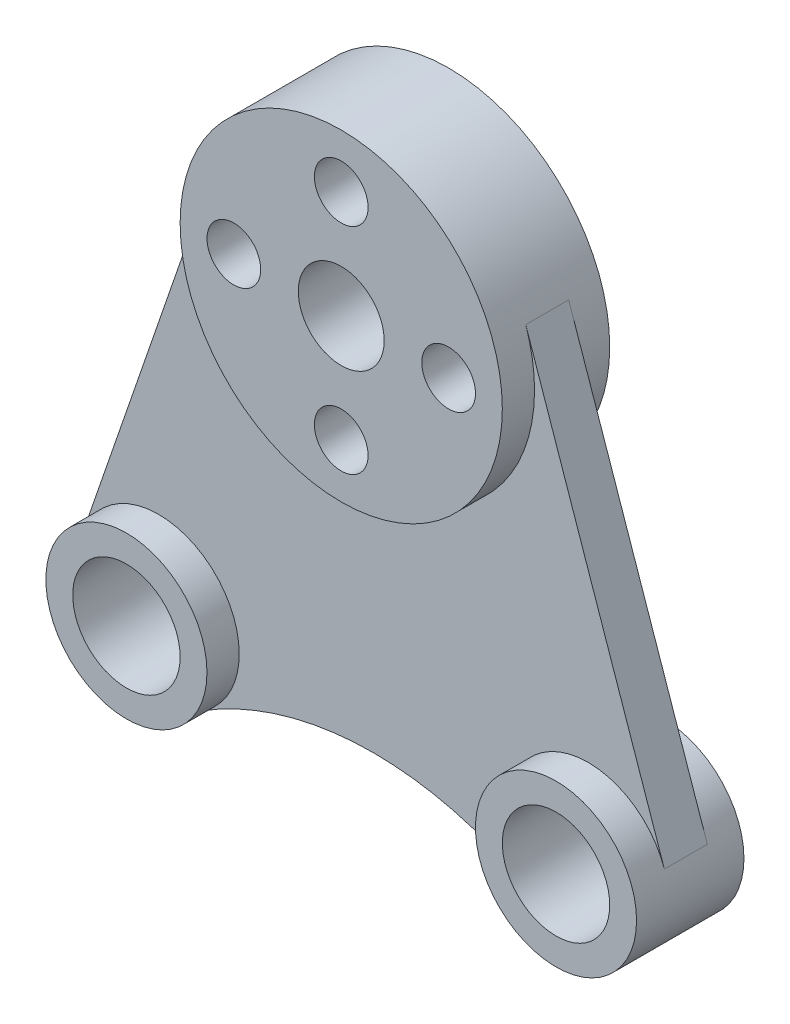
ISO-10303-21;
HEADER;
FILE_DESCRIPTION(('STEP AP214'),'2;1');
FILE_NAME('part.step','',(''),(''),'','','');
FILE_SCHEMA(('AUTOMOTIVE_DESIGN { 1 0 10303 214 1 1 1 1 }'));
ENDSEC;
DATA;
#1=APPLICATION_CONTEXT('core data for automotive mechanical design processes');
#2=APPLICATION_PROTOCOL_DEFINITION('international standard','automotive_design',2000,#1);
#3=PRODUCT_CONTEXT('',#1,'mechanical');
#4=PRODUCT('Part','Part','',(#3));
#5=PRODUCT_RELATED_PRODUCT_CATEGORY('part','',(#4));
#6=PRODUCT_DEFINITION_FORMATION('','',#4);
#7=PRODUCT_DEFINITION_CONTEXT('part definition',#1,'design');
#8=PRODUCT_DEFINITION('design','',#6,#7);
#9=PRODUCT_DEFINITION_SHAPE('','',#8);
#10=(LENGTH_UNIT() NAMED_UNIT(*) SI_UNIT(.MILLI.,.METRE.));
#11=(NAMED_UNIT(*) PLANE_ANGLE_UNIT() SI_UNIT($,.RADIAN.));
#12=(NAMED_UNIT(*) SI_UNIT($,.STERADIAN.) SOLID_ANGLE_UNIT());
#13=UNCERTAINTY_MEASURE_WITH_UNIT(LENGTH_MEASURE(1.E-05),#10,'distance_accuracy_value','');
#14=(GEOMETRIC_REPRESENTATION_CONTEXT(3) GLOBAL_UNCERTAINTY_ASSIGNED_CONTEXT((#13)) GLOBAL_UNIT_ASSIGNED_CONTEXT((#10,
#11,#12)) REPRESENTATION_CONTEXT('',''));
#15=CARTESIAN_POINT('',(0.,0.,0.));
#16=DIRECTION('',(0.,0.,1.));
#17=DIRECTION('',(1.,0.,0.));
#18=AXIS2_PLACEMENT_3D('',#15,#16,#17);
#19=CARTESIAN_POINT('',(0.,0.,10.));
#20=DIRECTION('',(0.,0.,-1.));
#21=DIRECTION('',(-1.,0.,0.));
#22=AXIS2_PLACEMENT_3D('',#19,#20,#21);
#23=CYLINDRICAL_SURFACE('',#22,8.);
#24=CARTESIAN_POINT('',(0.,0.,10.));
#25=DIRECTION('',(0.,0.,1.));
#26=DIRECTION('',(1.,0.,0.));
#27=AXIS2_PLACEMENT_3D('',#24,#25,#26);
#28=CIRCLE('',#27,8.);
#29=CARTESIAN_POINT('',(8.,0.,10.));
#30=VERTEX_POINT('',#29);
#31=EDGE_CURVE('E59',#30,#30,#28,.T.);
#32=ORIENTED_EDGE('',*,*,#31,.T.);
#33=EDGE_LOOP('',(#32));
#34=FACE_BOUND('',#33,.T.);
#35=CARTESIAN_POINT('',(0.,0.,-10.));
#36=DIRECTION('',(0.,0.,1.));
#37=DIRECTION('',(1.,0.,0.));
#38=AXIS2_PLACEMENT_3D('',#35,#36,#37);
#39=CIRCLE('',#38,8.);
#40=CARTESIAN_POINT('',(8.,0.,-10.));
#41=VERTEX_POINT('',#40);
#42=EDGE_CURVE('E191',#41,#41,#39,.T.);
#43=ORIENTED_EDGE('',*,*,#42,.F.);
#44=EDGE_LOOP('',(#43));
#45=FACE_BOUND('',#44,.T.);
#46=ADVANCED_FACE('F49',(#34,#45),#23,.F.);
#47=CARTESIAN_POINT('',(20.,0.,10.));
#48=DIRECTION('',(0.,0.,-1.));
#49=DIRECTION('',(-1.,0.,0.));
#50=AXIS2_PLACEMENT_3D('',#47,#48,#49);
#51=CYLINDRICAL_SURFACE('',#50,5.);
#52=CARTESIAN_POINT('',(20.,0.,10.));
#53=DIRECTION('',(0.,0.,1.));
#54=DIRECTION('',(1.,0.,0.));
#55=AXIS2_PLACEMENT_3D('',#52,#53,#54);
#56=CIRCLE('',#55,5.);
#57=CARTESIAN_POINT('',(25.,0.,10.));
#58=VERTEX_POINT('',#57);
#59=EDGE_CURVE('E170',#58,#58,#56,.T.);
#60=ORIENTED_EDGE('',*,*,#59,.T.);
#61=EDGE_LOOP('',(#60));
#62=FACE_BOUND('',#61,.T.);
#63=CARTESIAN_POINT('',(20.,0.,-10.));
#64=DIRECTION('',(0.,0.,1.));
#65=DIRECTION('',(1.,0.,0.));
#66=AXIS2_PLACEMENT_3D('',#63,#64,#65);
#67=CIRCLE('',#66,5.);
#68=CARTESIAN_POINT('',(25.,0.,-10.));
#69=VERTEX_POINT('',#68);
#70=EDGE_CURVE('E188',#69,#69,#67,.T.);
#71=ORIENTED_EDGE('',*,*,#70,.F.);
#72=EDGE_LOOP('',(#71));
#73=FACE_BOUND('',#72,.T.);
#74=ADVANCED_FACE('F219',(#62,#73),#51,.F.);
#75=CARTESIAN_POINT('',(0.,-20.,10.));
#76=DIRECTION('',(0.,0.,-1.));
#77=DIRECTION('',(-1.,0.,0.));
#78=AXIS2_PLACEMENT_3D('',#75,#76,#77);
#79=CYLINDRICAL_SURFACE('',#78,5.);
#80=CARTESIAN_POINT('',(0.,-20.,10.));
#81=DIRECTION('',(0.,0.,1.));
#82=DIRECTION('',(1.,0.,0.));
#83=AXIS2_PLACEMENT_3D('',#80,#81,#82);
#84=CIRCLE('',#83,5.);
#85=CARTESIAN_POINT('',(5.,-20.,10.));
#86=VERTEX_POINT('',#85);
#87=EDGE_CURVE('E166',#86,#86,#84,.T.);
#88=ORIENTED_EDGE('',*,*,#87,.T.);
#89=EDGE_LOOP('',(#88));
#90=FACE_BOUND('',#89,.T.);
#91=CARTESIAN_POINT('',(0.,-20.,-10.));
#92=DIRECTION('',(0.,0.,1.));
#93=DIRECTION('',(1.,0.,0.));
#94=AXIS2_PLACEMENT_3D('',#91,#92,#93);
#95=CIRCLE('',#94,5.);
#96=CARTESIAN_POINT('',(5.,-20.,-10.));
#97=VERTEX_POINT('',#96);
#98=EDGE_CURVE('E184',#97,#97,#95,.T.);
#99=ORIENTED_EDGE('',*,*,#98,.F.);
#100=EDGE_LOOP('',(#99));
#101=FACE_BOUND('',#100,.T.);
#102=ADVANCED_FACE('F225',(#90,#101),#79,.F.);
#103=CARTESIAN_POINT('',(-20.,0.,10.));
#104=DIRECTION('',(0.,0.,-1.));
#105=DIRECTION('',(-1.,0.,0.));
#106=AXIS2_PLACEMENT_3D('',#103,#104,#105);
#107=CYLINDRICAL_SURFACE('',#106,4.99999999999999);
#108=CARTESIAN_POINT('',(-20.,0.,10.));
#109=DIRECTION('',(0.,0.,1.));
#110=DIRECTION('',(1.,0.,0.));
#111=AXIS2_PLACEMENT_3D('',#108,#109,#110);
#112=CIRCLE('',#111,4.99999999999999);
#113=CARTESIAN_POINT('',(-15.,0.,10.));
#114=VERTEX_POINT('',#113);
#115=EDGE_CURVE('E162',#114,#114,#112,.T.);
#116=ORIENTED_EDGE('',*,*,#115,.T.);
#117=EDGE_LOOP('',(#116));
#118=FACE_BOUND('',#117,.T.);
#119=CARTESIAN_POINT('',(-20.,0.,-10.));
#120=DIRECTION('',(0.,0.,1.));
#121=DIRECTION('',(1.,0.,0.));
#122=AXIS2_PLACEMENT_3D('',#119,#120,#121);
#123=CIRCLE('',#122,4.99999999999999);
#124=CARTESIAN_POINT('',(-15.,0.,-10.));
#125=VERTEX_POINT('',#124);
#126=EDGE_CURVE('E180',#125,#125,#123,.T.);
#127=ORIENTED_EDGE('',*,*,#126,.F.);
#128=EDGE_LOOP('',(#127));
#129=FACE_BOUND('',#128,.T.);
#130=ADVANCED_FACE('F231',(#118,#129),#107,.F.);
#131=CARTESIAN_POINT('',(0.,20.,10.));
#132=DIRECTION('',(0.,0.,-1.));
#133=DIRECTION('',(-1.,0.,0.));
#134=AXIS2_PLACEMENT_3D('',#131,#132,#133);
#135=CYLINDRICAL_SURFACE('',#134,5.);
#136=CARTESIAN_POINT('',(0.,20.,10.));
#137=DIRECTION('',(0.,0.,1.));
#138=DIRECTION('',(1.,0.,0.));
#139=AXIS2_PLACEMENT_3D('',#136,#137,#138);
#140=CIRCLE('',#139,5.);
#141=CARTESIAN_POINT('',(4.99999999999999,20.,10.));
#142=VERTEX_POINT('',#141);
#143=EDGE_CURVE('E158',#142,#142,#140,.T.);
#144=ORIENTED_EDGE('',*,*,#143,.T.);
#145=EDGE_LOOP('',(#144));
#146=FACE_BOUND('',#145,.T.);
#147=CARTESIAN_POINT('',(0.,20.,-10.));
#148=DIRECTION('',(0.,0.,1.));
#149=DIRECTION('',(1.,0.,0.));
#150=AXIS2_PLACEMENT_3D('',#147,#148,#149);
#151=CIRCLE('',#150,5.);
#152=CARTESIAN_POINT('',(4.99999999999999,20.,-10.));
#153=VERTEX_POINT('',#152);
#154=EDGE_CURVE('E157',#153,#153,#151,.T.);
#155=ORIENTED_EDGE('',*,*,#154,.F.);
#156=EDGE_LOOP('',(#155));
#157=FACE_BOUND('',#156,.T.);
#158=ADVANCED_FACE('F51',(#146,#157),#135,.F.);
#159=CARTESIAN_POINT('',(0.,0.,10.));
#160=DIRECTION('',(0.,0.,-1.));
#161=DIRECTION('',(-1.,0.,0.));
#162=AXIS2_PLACEMENT_3D('',#159,#160,#161);
#163=CYLINDRICAL_SURFACE('',#162,30.);
#164=DIRECTION('',(0.,0.,-1.));
#165=VECTOR('',#164,1.);
#166=CARTESIAN_POINT('',(-28.3617361440656,9.77813493946602,4.));
#167=LINE('',#166,#165);
#168=CARTESIAN_POINT('',(-28.3617361440655,9.77813493946602,4.));
#169=VERTEX_POINT('',#168);
#170=CARTESIAN_POINT('',(-28.3617361440656,9.77813493946602,-4.));
#171=VERTEX_POINT('',#170);
#172=EDGE_CURVE('E72',#169,#171,#167,.T.);
#173=ORIENTED_EDGE('',*,*,#172,.F.);
#174=CARTESIAN_POINT('',(0.,0.,4.));
#175=DIRECTION('',(0.,0.,1.));
#176=DIRECTION('',(1.,0.,0.));
#177=AXIS2_PLACEMENT_3D('',#174,#175,#176);
#178=CIRCLE('',#177,30.);
#179=CARTESIAN_POINT('',(28.3617361440655,9.77813493946602,4.));
#180=VERTEX_POINT('',#179);
#181=EDGE_CURVE('E67',#169,#180,#178,.T.);
#182=ORIENTED_EDGE('',*,*,#181,.T.);
#183=DIRECTION('',(0.,0.,-1.));
#184=VECTOR('',#183,1.);
#185=CARTESIAN_POINT('',(28.3617361440656,9.77813493946602,4.));
#186=LINE('',#185,#184);
#187=CARTESIAN_POINT('',(28.3617361440656,9.77813493946602,-4.));
#188=VERTEX_POINT('',#187);
#189=EDGE_CURVE('E127',#180,#188,#186,.T.);
#190=ORIENTED_EDGE('',*,*,#189,.T.);
#191=CARTESIAN_POINT('',(0.,0.,-4.));
#192=DIRECTION('',(0.,0.,1.));
#193=DIRECTION('',(1.,0.,0.));
#194=AXIS2_PLACEMENT_3D('',#191,#192,#193);
#195=CIRCLE('',#194,30.);
#196=EDGE_CURVE('E132',#171,#188,#195,.T.);
#197=ORIENTED_EDGE('',*,*,#196,.F.);
#198=EDGE_LOOP('',(#173,#182,#190,#197));
#199=FACE_BOUND('',#198,.T.);
#200=CARTESIAN_POINT('',(0.,0.,10.));
#201=DIRECTION('',(0.,0.,1.));
#202=DIRECTION('',(1.,0.,0.));
#203=AXIS2_PLACEMENT_3D('',#200,#201,#202);
#204=CIRCLE('',#203,30.);
#205=CARTESIAN_POINT('',(30.,0.,10.));
#206=VERTEX_POINT('',#205);
#207=EDGE_CURVE('E12',#206,#206,#204,.T.);
#208=ORIENTED_EDGE('',*,*,#207,.F.);
#209=EDGE_LOOP('',(#208));
#210=FACE_BOUND('',#209,.T.);
#211=CARTESIAN_POINT('',(0.,0.,-10.));
#212=DIRECTION('',(0.,0.,1.));
#213=DIRECTION('',(1.,0.,0.));
#214=AXIS2_PLACEMENT_3D('',#211,#212,#213);
#215=CIRCLE('',#214,30.);
#216=CARTESIAN_POINT('',(30.,0.,-10.));
#217=VERTEX_POINT('',#216);
#218=EDGE_CURVE('E53',#217,#217,#215,.T.);
#219=ORIENTED_EDGE('',*,*,#218,.T.);
#220=EDGE_LOOP('',(#219));
#221=FACE_BOUND('',#220,.T.);
#222=ADVANCED_FACE('F200',(#199,#210,#221),#163,.T.);
#223=CARTESIAN_POINT('',(0.,0.,10.));
#224=DIRECTION('',(0.,0.,1.));
#225=DIRECTION('',(1.,0.,0.));
#226=AXIS2_PLACEMENT_3D('',#223,#224,#225);
#227=PLANE('',#226);
#228=ORIENTED_EDGE('',*,*,#143,.F.);
#229=EDGE_LOOP('',(#228));
#230=FACE_BOUND('',#229,.T.);
#231=ORIENTED_EDGE('',*,*,#115,.F.);
#232=EDGE_LOOP('',(#231));
#233=FACE_BOUND('',#232,.T.);
#234=ORIENTED_EDGE('',*,*,#87,.F.);
#235=EDGE_LOOP('',(#234));
#236=FACE_BOUND('',#235,.T.);
#237=ORIENTED_EDGE('',*,*,#59,.F.);
#238=EDGE_LOOP('',(#237));
#239=FACE_BOUND('',#238,.T.);
#240=ORIENTED_EDGE('',*,*,#31,.F.);
#241=EDGE_LOOP('',(#240));
#242=FACE_BOUND('',#241,.T.);
#243=ORIENTED_EDGE('',*,*,#207,.T.);
#244=EDGE_LOOP('',(#243));
#245=FACE_BOUND('',#244,.T.);
#246=ADVANCED_FACE('F205',(#230,#233,#236,#239,#242,#245),#227,.T.);
#247=CARTESIAN_POINT('',(0.,0.,-10.));
#248=DIRECTION('',(0.,0.,1.));
#249=DIRECTION('',(1.,0.,0.));
#250=AXIS2_PLACEMENT_3D('',#247,#248,#249);
#251=PLANE('',#250);
#252=ORIENTED_EDGE('',*,*,#154,.T.);
#253=EDGE_LOOP('',(#252));
#254=FACE_BOUND('',#253,.T.);
#255=ORIENTED_EDGE('',*,*,#126,.T.);
#256=EDGE_LOOP('',(#255));
#257=FACE_BOUND('',#256,.T.);
#258=ORIENTED_EDGE('',*,*,#98,.T.);
#259=EDGE_LOOP('',(#258));
#260=FACE_BOUND('',#259,.T.);
#261=ORIENTED_EDGE('',*,*,#70,.T.);
#262=EDGE_LOOP('',(#261));
#263=FACE_BOUND('',#262,.T.);
#264=ORIENTED_EDGE('',*,*,#42,.T.);
#265=EDGE_LOOP('',(#264));
#266=FACE_BOUND('',#265,.T.);
#267=ORIENTED_EDGE('',*,*,#218,.F.);
#268=EDGE_LOOP('',(#267));
#269=FACE_BOUND('',#268,.T.);
#270=ADVANCED_FACE('F202',(#254,#257,#260,#263,#266,#269),#251,.F.);
#271=CARTESIAN_POINT('',(0.,-133.442887702248,4.));
#272=DIRECTION('',(0.,0.,-1.));
#273=DIRECTION('',(-1.,0.,0.));
#274=AXIS2_PLACEMENT_3D('',#271,#272,#273);
#275=CYLINDRICAL_SURFACE('',#274,60.);
#276=CARTESIAN_POINT('',(0.,-133.442887702248,-4.));
#277=DIRECTION('',(0.,0.,1.));
#278=DIRECTION('',(1.,0.,0.));
#279=AXIS2_PLACEMENT_3D('',#276,#277,#278);
#280=CIRCLE('',#279,60.);
#281=CARTESIAN_POINT('',(-32.,-82.6885775404495,-4.));
#282=VERTEX_POINT('',#281);
#283=CARTESIAN_POINT('',(32.,-82.6885775404495,-4.));
#284=VERTEX_POINT('',#283);
#285=EDGE_CURVE('E117',#282,#284,#280,.F.);
#286=ORIENTED_EDGE('',*,*,#285,.T.);
#287=DIRECTION('',(0.,0.,-1.));
#288=VECTOR('',#287,1.);
#289=CARTESIAN_POINT('',(32.,-82.6885775404495,4.));
#290=LINE('',#289,#288);
#291=CARTESIAN_POINT('',(32.,-82.6885775404495,4.));
#292=VERTEX_POINT('',#291);
#293=EDGE_CURVE('E110',#292,#284,#290,.T.);
#294=ORIENTED_EDGE('',*,*,#293,.F.);
#295=CARTESIAN_POINT('',(0.,-133.442887702248,4.));
#296=DIRECTION('',(0.,0.,1.));
#297=DIRECTION('',(1.,0.,0.));
#298=AXIS2_PLACEMENT_3D('',#295,#296,#297);
#299=CIRCLE('',#298,60.);
#300=CARTESIAN_POINT('',(-32.,-82.6885775404495,4.));
#301=VERTEX_POINT('',#300);
#302=EDGE_CURVE('E430',#301,#292,#299,.F.);
#303=ORIENTED_EDGE('',*,*,#302,.F.);
#304=DIRECTION('',(0.,0.,-1.));
#305=VECTOR('',#304,1.);
#306=CARTESIAN_POINT('',(-32.,-82.6885775404495,4.));
#307=LINE('',#306,#305);
#308=EDGE_CURVE('E154',#301,#282,#307,.T.);
#309=ORIENTED_EDGE('',*,*,#308,.T.);
#310=EDGE_LOOP('',(#286,#294,#303,#309));
#311=FACE_BOUND('',#310,.T.);
#312=ADVANCED_FACE('F204',(#311),#275,.F.);
#313=CARTESIAN_POINT('',(28.3617361440656,9.77813493946602,4.));
#314=DIRECTION('',(0.945391204802185,0.325937831315534,0.));
#315=DIRECTION('',(-0.325937831315534,0.945391204802185,0.));
#316=AXIS2_PLACEMENT_3D('',#313,#314,#315);
#317=PLANE('',#316);
#318=DIRECTION('',(0.325937831315534,-0.945391204802185,0.));
#319=VECTOR('',#318,1.);
#320=CARTESIAN_POINT('',(28.3617361440656,9.77813493946602,-4.));
#321=LINE('',#320,#319);
#322=CARTESIAN_POINT('',(54.1808680720328,-65.110932530267,-4.));
#323=VERTEX_POINT('',#322);
#324=EDGE_CURVE('E116',#188,#323,#321,.T.);
#325=ORIENTED_EDGE('',*,*,#324,.F.);
#326=ORIENTED_EDGE('',*,*,#189,.F.);
#327=DIRECTION('',(0.325937831315534,-0.945391204802185,0.));
#328=VECTOR('',#327,1.);
#329=CARTESIAN_POINT('',(28.3617361440656,9.77813493946602,4.));
#330=LINE('',#329,#328);
#331=CARTESIAN_POINT('',(54.1808680720328,-65.110932530267,4.));
#332=VERTEX_POINT('',#331);
#333=EDGE_CURVE('E125',#180,#332,#330,.T.);
#334=ORIENTED_EDGE('',*,*,#333,.T.);
#335=DIRECTION('',(0.,0.,-1.));
#336=VECTOR('',#335,1.);
#337=CARTESIAN_POINT('',(54.1808680720328,-65.110932530267,4.));
#338=LINE('',#337,#336);
#339=EDGE_CURVE('E107',#332,#323,#338,.T.);
#340=ORIENTED_EDGE('',*,*,#339,.T.);
#341=EDGE_LOOP('',(#325,#326,#334,#340));
#342=FACE_BOUND('',#341,.T.);
#343=ADVANCED_FACE('F122',(#342),#317,.T.);
#344=CARTESIAN_POINT('',(-28.3617361440656,9.77813493946602,4.));
#345=DIRECTION('',(0.945391204802185,-0.325937831315534,0.));
#346=DIRECTION('',(0.325937831315534,0.945391204802185,0.));
#347=AXIS2_PLACEMENT_3D('',#344,#345,#346);
#348=PLANE('',#347);
#349=DIRECTION('',(-0.325937831315534,-0.945391204802185,0.));
#350=VECTOR('',#349,1.);
#351=CARTESIAN_POINT('',(-28.3617361440656,9.77813493946602,-4.));
#352=LINE('',#351,#350);
#353=CARTESIAN_POINT('',(-54.1808680720328,-65.110932530267,-4.));
#354=VERTEX_POINT('',#353);
#355=EDGE_CURVE('E136',#171,#354,#352,.T.);
#356=ORIENTED_EDGE('',*,*,#355,.T.);
#357=DIRECTION('',(0.,0.,-1.));
#358=VECTOR('',#357,1.);
#359=CARTESIAN_POINT('',(-54.1808680720328,-65.110932530267,4.));
#360=LINE('',#359,#358);
#361=CARTESIAN_POINT('',(-54.1808680720328,-65.110932530267,4.));
#362=VERTEX_POINT('',#361);
#363=EDGE_CURVE('E143',#362,#354,#360,.T.);
#364=ORIENTED_EDGE('',*,*,#363,.F.);
#365=DIRECTION('',(-0.325937831315534,-0.945391204802185,0.));
#366=VECTOR('',#365,1.);
#367=CARTESIAN_POINT('',(-28.3617361440656,9.77813493946602,4.));
#368=LINE('',#367,#366);
#369=EDGE_CURVE('E147',#169,#362,#368,.T.);
#370=ORIENTED_EDGE('',*,*,#369,.F.);
#371=ORIENTED_EDGE('',*,*,#172,.T.);
#372=EDGE_LOOP('',(#356,#364,#370,#371));
#373=FACE_BOUND('',#372,.T.);
#374=ADVANCED_FACE('F372',(#373),#348,.F.);
#375=CARTESIAN_POINT('',(0.,0.,4.));
#376=DIRECTION('',(0.,0.,1.));
#377=DIRECTION('',(1.,0.,0.));
#378=AXIS2_PLACEMENT_3D('',#375,#376,#377);
#379=PLANE('',#378);
#380=CARTESIAN_POINT('',(-40.,-70.,4.));
#381=DIRECTION('',(0.,0.,1.));
#382=DIRECTION('',(1.,0.,0.));
#383=AXIS2_PLACEMENT_3D('',#380,#381,#382);
#384=CIRCLE('',#383,15.);
#385=EDGE_CURVE('E142',#362,#301,#384,.F.);
#386=ORIENTED_EDGE('',*,*,#385,.T.);
#387=ORIENTED_EDGE('',*,*,#302,.T.);
#388=CARTESIAN_POINT('',(40.,-70.,4.));
#389=DIRECTION('',(0.,0.,1.));
#390=DIRECTION('',(1.,0.,0.));
#391=AXIS2_PLACEMENT_3D('',#388,#389,#390);
#392=CIRCLE('',#391,15.);
#393=EDGE_CURVE('E448',#332,#292,#392,.T.);
#394=ORIENTED_EDGE('',*,*,#393,.F.);
#395=ORIENTED_EDGE('',*,*,#333,.F.);
#396=ORIENTED_EDGE('',*,*,#181,.F.);
#397=ORIENTED_EDGE('',*,*,#369,.T.);
#398=EDGE_LOOP('',(#386,#387,#394,#395,#396,#397));
#399=FACE_BOUND('',#398,.T.);
#400=ADVANCED_FACE('F382',(#399),#379,.T.);
#401=CARTESIAN_POINT('',(0.,0.,-4.));
#402=DIRECTION('',(0.,0.,1.));
#403=DIRECTION('',(1.,0.,0.));
#404=AXIS2_PLACEMENT_3D('',#401,#402,#403);
#405=PLANE('',#404);
#406=CARTESIAN_POINT('',(-40.,-70.,-4.));
#407=DIRECTION('',(0.,0.,1.));
#408=DIRECTION('',(1.,0.,0.));
#409=AXIS2_PLACEMENT_3D('',#406,#407,#408);
#410=CIRCLE('',#409,15.);
#411=EDGE_CURVE('E436',#354,#282,#410,.F.);
#412=ORIENTED_EDGE('',*,*,#411,.F.);
#413=ORIENTED_EDGE('',*,*,#355,.F.);
#414=ORIENTED_EDGE('',*,*,#196,.T.);
#415=ORIENTED_EDGE('',*,*,#324,.T.);
#416=CARTESIAN_POINT('',(40.,-70.,-4.));
#417=DIRECTION('',(0.,0.,1.));
#418=DIRECTION('',(1.,0.,0.));
#419=AXIS2_PLACEMENT_3D('',#416,#417,#418);
#420=CIRCLE('',#419,15.);
#421=EDGE_CURVE('E103',#323,#284,#420,.T.);
#422=ORIENTED_EDGE('',*,*,#421,.T.);
#423=ORIENTED_EDGE('',*,*,#285,.F.);
#424=EDGE_LOOP('',(#412,#413,#414,#415,#422,#423));
#425=FACE_BOUND('',#424,.T.);
#426=ADVANCED_FACE('F130',(#425),#405,.F.);
#427=CARTESIAN_POINT('',(-40.,-70.,10.));
#428=DIRECTION('',(0.,0.,-1.));
#429=DIRECTION('',(-1.,0.,0.));
#430=AXIS2_PLACEMENT_3D('',#427,#428,#429);
#431=CYLINDRICAL_SURFACE('',#430,15.);
#432=ORIENTED_EDGE('',*,*,#308,.F.);
#433=ORIENTED_EDGE('',*,*,#385,.F.);
#434=ORIENTED_EDGE('',*,*,#363,.T.);
#435=ORIENTED_EDGE('',*,*,#411,.T.);
#436=EDGE_LOOP('',(#432,#433,#434,#435));
#437=FACE_BOUND('',#436,.T.);
#438=CARTESIAN_POINT('',(-40.,-70.,10.));
#439=DIRECTION('',(0.,0.,1.));
#440=DIRECTION('',(1.,0.,0.));
#441=AXIS2_PLACEMENT_3D('',#438,#439,#440);
#442=CIRCLE('',#441,15.);
#443=CARTESIAN_POINT('',(-25.,-70.,10.));
#444=VERTEX_POINT('',#443);
#445=EDGE_CURVE('E453',#444,#444,#442,.F.);
#446=ORIENTED_EDGE('',*,*,#445,.T.);
#447=EDGE_LOOP('',(#446));
#448=FACE_BOUND('',#447,.T.);
#449=CARTESIAN_POINT('',(-40.,-70.,-10.));
#450=DIRECTION('',(0.,0.,1.));
#451=DIRECTION('',(1.,0.,0.));
#452=AXIS2_PLACEMENT_3D('',#449,#450,#451);
#453=CIRCLE('',#452,15.);
#454=CARTESIAN_POINT('',(-25.,-70.,-10.));
#455=VERTEX_POINT('',#454);
#456=EDGE_CURVE('E439',#455,#455,#453,.F.);
#457=ORIENTED_EDGE('',*,*,#456,.F.);
#458=EDGE_LOOP('',(#457));
#459=FACE_BOUND('',#458,.T.);
#460=ADVANCED_FACE('F283',(#437,#448,#459),#431,.T.);
#461=CARTESIAN_POINT('',(-40.,-70.,10.));
#462=DIRECTION('',(0.,0.,-1.));
#463=DIRECTION('',(-1.,0.,0.));
#464=AXIS2_PLACEMENT_3D('',#461,#462,#463);
#465=CYLINDRICAL_SURFACE('',#464,10.);
#466=CARTESIAN_POINT('',(-40.,-70.,10.));
#467=DIRECTION('',(0.,0.,1.));
#468=DIRECTION('',(1.,0.,0.));
#469=AXIS2_PLACEMENT_3D('',#466,#467,#468);
#470=CIRCLE('',#469,10.);
#471=CARTESIAN_POINT('',(-30.,-70.,10.));
#472=VERTEX_POINT('',#471);
#473=EDGE_CURVE('E458',#472,#472,#470,.F.);
#474=ORIENTED_EDGE('',*,*,#473,.F.);
#475=EDGE_LOOP('',(#474));
#476=FACE_BOUND('',#475,.T.);
#477=CARTESIAN_POINT('',(-40.,-70.,-10.));
#478=DIRECTION('',(0.,0.,1.));
#479=DIRECTION('',(1.,0.,0.));
#480=AXIS2_PLACEMENT_3D('',#477,#478,#479);
#481=CIRCLE('',#480,10.);
#482=CARTESIAN_POINT('',(-30.,-70.,-10.));
#483=VERTEX_POINT('',#482);
#484=EDGE_CURVE('E457',#483,#483,#481,.F.);
#485=ORIENTED_EDGE('',*,*,#484,.T.);
#486=EDGE_LOOP('',(#485));
#487=FACE_BOUND('',#486,.T.);
#488=ADVANCED_FACE('F288',(#476,#487),#465,.F.);
#489=CARTESIAN_POINT('',(0.,0.,10.));
#490=DIRECTION('',(0.,0.,1.));
#491=DIRECTION('',(1.,0.,0.));
#492=AXIS2_PLACEMENT_3D('',#489,#490,#491);
#493=PLANE('',#492);
#494=ORIENTED_EDGE('',*,*,#445,.F.);
#495=EDGE_LOOP('',(#494));
#496=FACE_BOUND('',#495,.T.);
#497=ORIENTED_EDGE('',*,*,#473,.T.);
#498=EDGE_LOOP('',(#497));
#499=FACE_BOUND('',#498,.T.);
#500=ADVANCED_FACE('F298',(#496,#499),#493,.T.);
#501=CARTESIAN_POINT('',(0.,0.,-10.));
#502=DIRECTION('',(0.,0.,1.));
#503=DIRECTION('',(1.,0.,0.));
#504=AXIS2_PLACEMENT_3D('',#501,#502,#503);
#505=PLANE('',#504);
#506=ORIENTED_EDGE('',*,*,#456,.T.);
#507=EDGE_LOOP('',(#506));
#508=FACE_BOUND('',#507,.T.);
#509=ORIENTED_EDGE('',*,*,#484,.F.);
#510=EDGE_LOOP('',(#509));
#511=FACE_BOUND('',#510,.T.);
#512=ADVANCED_FACE('F308',(#508,#511),#505,.F.);
#513=CARTESIAN_POINT('',(0.,0.,10.));
#514=DIRECTION('',(0.,0.,1.));
#515=DIRECTION('',(1.,0.,0.));
#516=AXIS2_PLACEMENT_3D('',#513,#514,#515);
#517=PLANE('',#516);
#518=CARTESIAN_POINT('',(40.,-70.,10.));
#519=DIRECTION('',(0.,0.,1.));
#520=DIRECTION('',(1.,0.,0.));
#521=AXIS2_PLACEMENT_3D('',#518,#519,#520);
#522=CIRCLE('',#521,15.);
#523=CARTESIAN_POINT('',(55.,-70.,10.));
#524=VERTEX_POINT('',#523);
#525=EDGE_CURVE('E477',#524,#524,#522,.T.);
#526=ORIENTED_EDGE('',*,*,#525,.T.);
#527=EDGE_LOOP('',(#526));
#528=FACE_BOUND('',#527,.T.);
#529=CARTESIAN_POINT('',(40.,-70.,10.));
#530=DIRECTION('',(0.,0.,1.));
#531=DIRECTION('',(1.,0.,0.));
#532=AXIS2_PLACEMENT_3D('',#529,#530,#531);
#533=CIRCLE('',#532,10.);
#534=CARTESIAN_POINT('',(50.,-70.,10.));
#535=VERTEX_POINT('',#534);
#536=EDGE_CURVE('E469',#535,#535,#533,.T.);
#537=ORIENTED_EDGE('',*,*,#536,.F.);
#538=EDGE_LOOP('',(#537));
#539=FACE_BOUND('',#538,.T.);
#540=ADVANCED_FACE('F318',(#528,#539),#517,.T.);
#541=CARTESIAN_POINT('',(0.,0.,-10.));
#542=DIRECTION('',(0.,0.,1.));
#543=DIRECTION('',(1.,0.,0.));
#544=AXIS2_PLACEMENT_3D('',#541,#542,#543);
#545=PLANE('',#544);
#546=CARTESIAN_POINT('',(40.,-70.,-10.));
#547=DIRECTION('',(0.,0.,1.));
#548=DIRECTION('',(1.,0.,0.));
#549=AXIS2_PLACEMENT_3D('',#546,#547,#548);
#550=CIRCLE('',#549,15.);
#551=CARTESIAN_POINT('',(55.,-70.,-10.));
#552=VERTEX_POINT('',#551);
#553=EDGE_CURVE('E473',#552,#552,#550,.T.);
#554=ORIENTED_EDGE('',*,*,#553,.F.);
#555=EDGE_LOOP('',(#554));
#556=FACE_BOUND('',#555,.T.);
#557=CARTESIAN_POINT('',(40.,-70.,-10.));
#558=DIRECTION('',(0.,0.,1.));
#559=DIRECTION('',(1.,0.,0.));
#560=AXIS2_PLACEMENT_3D('',#557,#558,#559);
#561=CIRCLE('',#560,10.);
#562=CARTESIAN_POINT('',(50.,-70.,-10.));
#563=VERTEX_POINT('',#562);
#564=EDGE_CURVE('E462',#563,#563,#561,.T.);
#565=ORIENTED_EDGE('',*,*,#564,.T.);
#566=EDGE_LOOP('',(#565));
#567=FACE_BOUND('',#566,.T.);
#568=ADVANCED_FACE('F328',(#556,#567),#545,.F.);
#569=CARTESIAN_POINT('',(40.,-70.,10.));
#570=DIRECTION('',(0.,0.,-1.));
#571=DIRECTION('',(-1.,0.,0.));
#572=AXIS2_PLACEMENT_3D('',#569,#570,#571);
#573=CYLINDRICAL_SURFACE('',#572,15.);
#574=ORIENTED_EDGE('',*,*,#393,.T.);
#575=ORIENTED_EDGE('',*,*,#293,.T.);
#576=ORIENTED_EDGE('',*,*,#421,.F.);
#577=ORIENTED_EDGE('',*,*,#339,.F.);
#578=EDGE_LOOP('',(#574,#575,#576,#577));
#579=FACE_BOUND('',#578,.T.);
#580=ORIENTED_EDGE('',*,*,#525,.F.);
#581=EDGE_LOOP('',(#580));
#582=FACE_BOUND('',#581,.T.);
#583=ORIENTED_EDGE('',*,*,#553,.T.);
#584=EDGE_LOOP('',(#583));
#585=FACE_BOUND('',#584,.T.);
#586=ADVANCED_FACE('F105',(#579,#582,#585),#573,.T.);
#587=CARTESIAN_POINT('',(40.,-70.,10.));
#588=DIRECTION('',(0.,0.,-1.));
#589=DIRECTION('',(-1.,0.,0.));
#590=AXIS2_PLACEMENT_3D('',#587,#588,#589);
#591=CYLINDRICAL_SURFACE('',#590,10.);
#592=ORIENTED_EDGE('',*,*,#536,.T.);
#593=EDGE_LOOP('',(#592));
#594=FACE_BOUND('',#593,.T.);
#595=ORIENTED_EDGE('',*,*,#564,.F.);
#596=EDGE_LOOP('',(#595));
#597=FACE_BOUND('',#596,.T.);
#598=ADVANCED_FACE('F347',(#594,#597),#591,.F.);
#599=CLOSED_SHELL('',(#46,#74,#102,#130,#158,#222,#246,#270,#312,#343,#374,#400,#426,#460,#488,
#500,#512,#540,#568,#586,#598));
#600=MANIFOLD_SOLID_BREP('B2',#599);
#601=ADVANCED_BREP_SHAPE_REPRESENTATION('',(#18,#600),#14);
#602=SHAPE_DEFINITION_REPRESENTATION(#9,#601);
ENDSEC;
END-ISO-10303-21;
